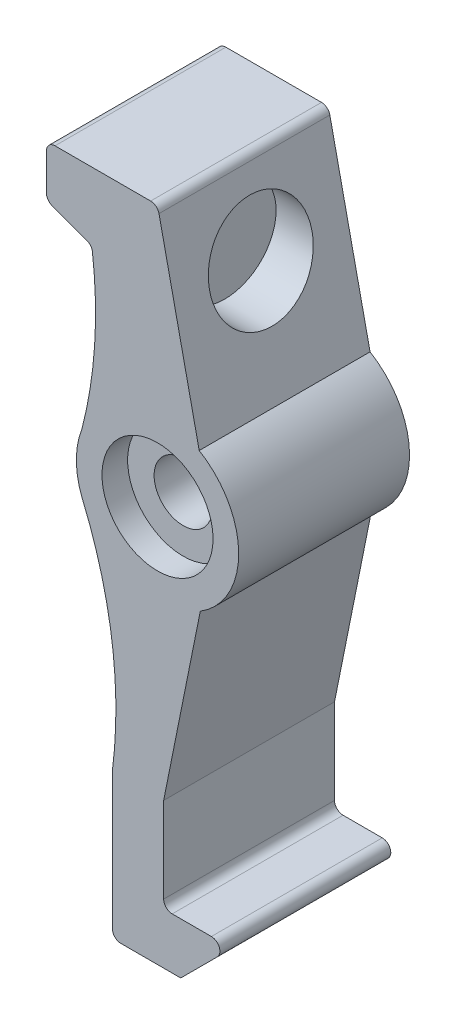
ISO-10303-21;
HEADER;
FILE_DESCRIPTION(('STEP AP214'),'2;1');
FILE_NAME('part.step','',(''),(''),'','','');
FILE_SCHEMA(('AUTOMOTIVE_DESIGN { 1 0 10303 214 1 1 1 1 }'));
ENDSEC;
DATA;
#1=APPLICATION_CONTEXT('core data for automotive mechanical design processes');
#2=APPLICATION_PROTOCOL_DEFINITION('international standard','automotive_design',2000,#1);
#3=PRODUCT_CONTEXT('',#1,'mechanical');
#4=PRODUCT('Part','Part','',(#3));
#5=PRODUCT_RELATED_PRODUCT_CATEGORY('part','',(#4));
#6=PRODUCT_DEFINITION_FORMATION('','',#4);
#7=PRODUCT_DEFINITION_CONTEXT('part definition',#1,'design');
#8=PRODUCT_DEFINITION('design','',#6,#7);
#9=PRODUCT_DEFINITION_SHAPE('','',#8);
#10=(LENGTH_UNIT() NAMED_UNIT(*) SI_UNIT(.MILLI.,.METRE.));
#11=(NAMED_UNIT(*) PLANE_ANGLE_UNIT() SI_UNIT($,.RADIAN.));
#12=(NAMED_UNIT(*) SI_UNIT($,.STERADIAN.) SOLID_ANGLE_UNIT());
#13=UNCERTAINTY_MEASURE_WITH_UNIT(LENGTH_MEASURE(1.E-05),#10,'distance_accuracy_value','');
#14=(GEOMETRIC_REPRESENTATION_CONTEXT(3) GLOBAL_UNCERTAINTY_ASSIGNED_CONTEXT((#13)) GLOBAL_UNIT_ASSIGNED_CONTEXT((#10,
#11,#12)) REPRESENTATION_CONTEXT('',''));
#15=CARTESIAN_POINT('',(0.,0.,0.));
#16=DIRECTION('',(0.,0.,1.));
#17=DIRECTION('',(1.,0.,0.));
#18=AXIS2_PLACEMENT_3D('',#15,#16,#17);
#19=CARTESIAN_POINT('',(0.,0.,-5.));
#20=DIRECTION('',(0.,0.,1.));
#21=DIRECTION('',(1.,0.,0.));
#22=AXIS2_PLACEMENT_3D('',#19,#20,#21);
#23=PLANE('',#22);
#24=DIRECTION('',(1.,0.,0.));
#25=VECTOR('',#24,1.);
#26=CARTESIAN_POINT('',(0.,15.3,-5.));
#27=LINE('',#26,#25);
#28=CARTESIAN_POINT('',(-6.,15.3,-5.));
#29=VERTEX_POINT('',#28);
#30=CARTESIAN_POINT('',(-0.402987495876589,15.3,-5.));
#31=VERTEX_POINT('',#30);
#32=EDGE_CURVE('E227',#29,#31,#27,.T.);
#33=ORIENTED_EDGE('',*,*,#32,.T.);
#34=CARTESIAN_POINT('',(-0.402987495876589,14.8,-5.));
#35=DIRECTION('',(0.,0.,1.));
#36=DIRECTION('',(1.,0.,0.));
#37=AXIS2_PLACEMENT_3D('',#34,#35,#36);
#38=CIRCLE('',#37,0.499999999999999);
#39=CARTESIAN_POINT('',(0.0856019190587525,14.9062091503268,-5.));
#40=VERTEX_POINT('',#39);
#41=EDGE_CURVE('E277',#31,#40,#38,.F.);
#42=ORIENTED_EDGE('',*,*,#41,.T.);
#43=DIRECTION('',(0.212418300653595,-0.977178829870684,0.));
#44=VECTOR('',#43,1.);
#45=CARTESIAN_POINT('',(3.17583119707972,0.690359477124184,-5.));
#46=LINE('',#45,#44);
#47=CARTESIAN_POINT('',(2.43999261870079,4.07540623995764,-5.));
#48=VERTEX_POINT('',#47);
#49=EDGE_CURVE('E275',#40,#48,#46,.T.);
#50=ORIENTED_EDGE('',*,*,#49,.T.);
#51=CARTESIAN_POINT('',(0.,0.,-5.));
#52=DIRECTION('',(0.,0.,1.));
#53=DIRECTION('',(1.,0.,0.));
#54=AXIS2_PLACEMENT_3D('',#51,#52,#53);
#55=CIRCLE('',#54,4.75);
#56=CARTESIAN_POINT('',(2.50332638844661,-4.03681272700467,-5.));
#57=VERTEX_POINT('',#56);
#58=EDGE_CURVE('E215',#57,#48,#55,.T.);
#59=ORIENTED_EDGE('',*,*,#58,.F.);
#60=DIRECTION('',(0.197135263261177,0.980376299172387,0.));
#61=VECTOR('',#60,1.);
#62=CARTESIAN_POINT('',(3.18622297231026,-0.640689605598826,-5.));
#63=LINE('',#62,#61);
#64=CARTESIAN_POINT('',(0.359159672013634,-14.7,-5.));
#65=VERTEX_POINT('',#64);
#66=EDGE_CURVE('E273',#65,#57,#63,.T.);
#67=ORIENTED_EDGE('',*,*,#66,.F.);
#68=DIRECTION('',(0.,-1.,0.));
#69=VECTOR('',#68,1.);
#70=CARTESIAN_POINT('',(0.359159672013633,0.,-5.));
#71=LINE('',#70,#69);
#72=CARTESIAN_POINT('',(0.359159672013635,-19.7,-5.));
#73=VERTEX_POINT('',#72);
#74=EDGE_CURVE('E270',#65,#73,#71,.T.);
#75=ORIENTED_EDGE('',*,*,#74,.T.);
#76=CARTESIAN_POINT('',(0.859159672013635,-19.7,-5.));
#77=DIRECTION('',(0.,0.,1.));
#78=DIRECTION('',(1.,0.,0.));
#79=AXIS2_PLACEMENT_3D('',#76,#77,#78);
#80=CIRCLE('',#79,0.5);
#81=CARTESIAN_POINT('',(0.859159672013635,-20.2,-5.));
#82=VERTEX_POINT('',#81);
#83=EDGE_CURVE('E267',#73,#82,#80,.T.);
#84=ORIENTED_EDGE('',*,*,#83,.T.);
#85=DIRECTION('',(1.,0.,0.));
#86=VECTOR('',#85,1.);
#87=CARTESIAN_POINT('',(0.,-20.2,-5.));
#88=LINE('',#87,#86);
#89=CARTESIAN_POINT('',(3.15205289082709,-20.2,-5.));
#90=VERTEX_POINT('',#89);
#91=EDGE_CURVE('E264',#82,#90,#88,.T.);
#92=ORIENTED_EDGE('',*,*,#91,.T.);
#93=CARTESIAN_POINT('',(3.15205289082709,-20.7,-5.));
#94=DIRECTION('',(0.,0.,1.));
#95=DIRECTION('',(1.,0.,0.));
#96=AXIS2_PLACEMENT_3D('',#93,#94,#95);
#97=CIRCLE('',#96,0.499999999999998);
#98=CARTESIAN_POINT('',(3.50560628142037,-21.0535533905933,-5.));
#99=VERTEX_POINT('',#98);
#100=EDGE_CURVE('E261',#90,#99,#97,.F.);
#101=ORIENTED_EDGE('',*,*,#100,.T.);
#102=DIRECTION('',(-0.707106781186546,-0.707106781186549,0.));
#103=VECTOR('',#102,1.);
#104=CARTESIAN_POINT('',(12.2795798360068,-12.2795798360068,-5.));
#105=LINE('',#104,#103);
#106=CARTESIAN_POINT('',(1.35915967201365,-23.2,-5.));
#107=VERTEX_POINT('',#106);
#108=EDGE_CURVE('E258',#99,#107,#105,.T.);
#109=ORIENTED_EDGE('',*,*,#108,.T.);
#110=DIRECTION('',(-1.,0.,0.));
#111=VECTOR('',#110,1.);
#112=CARTESIAN_POINT('',(0.,-23.2,-5.));
#113=LINE('',#112,#111);
#114=CARTESIAN_POINT('',(-2.14084032798637,-23.2,-5.));
#115=VERTEX_POINT('',#114);
#116=EDGE_CURVE('E255',#107,#115,#113,.T.);
#117=ORIENTED_EDGE('',*,*,#116,.T.);
#118=CARTESIAN_POINT('',(-2.14084032798637,-22.7,-5.));
#119=DIRECTION('',(0.,0.,1.));
#120=DIRECTION('',(1.,0.,0.));
#121=AXIS2_PLACEMENT_3D('',#118,#119,#120);
#122=CIRCLE('',#121,0.500000000000001);
#123=CARTESIAN_POINT('',(-2.64084032798637,-22.7,-5.));
#124=VERTEX_POINT('',#123);
#125=EDGE_CURVE('E252',#115,#124,#122,.F.);
#126=ORIENTED_EDGE('',*,*,#125,.T.);
#127=DIRECTION('',(0.,1.,0.));
#128=VECTOR('',#127,1.);
#129=CARTESIAN_POINT('',(-2.64084032798637,0.,-5.));
#130=LINE('',#129,#128);
#131=CARTESIAN_POINT('',(-2.64084032798637,-14.7,-5.));
#132=VERTEX_POINT('',#131);
#133=EDGE_CURVE('E249',#124,#132,#130,.T.);
#134=ORIENTED_EDGE('',*,*,#133,.T.);
#135=CARTESIAN_POINT('',(-27.4351945240529,-11.5,-5.));
#136=DIRECTION('',(0.,0.,1.));
#137=DIRECTION('',(1.,0.,0.));
#138=AXIS2_PLACEMENT_3D('',#135,#136,#137);
#139=CIRCLE('',#138,25.);
#140=CARTESIAN_POINT('',(-4.42869402465919,-1.7173145419369,-5.));
#141=VERTEX_POINT('',#140);
#142=EDGE_CURVE('E246',#141,#132,#139,.F.);
#143=ORIENTED_EDGE('',*,*,#142,.F.);
#144=CARTESIAN_POINT('',(-4.42869402465914,1.71731454193704,-5.));
#145=VERTEX_POINT('',#144);
#146=EDGE_CURVE('E244',#145,#141,#55,.T.);
#147=ORIENTED_EDGE('',*,*,#146,.F.);
#148=CARTESIAN_POINT('',(-28.6263770425649,8.,-5.));
#149=DIRECTION('',(0.,0.,1.));
#150=DIRECTION('',(1.,0.,0.));
#151=AXIS2_PLACEMENT_3D('',#148,#149,#150);
#152=CIRCLE('',#151,25.);
#153=CARTESIAN_POINT('',(-3.8107161008924,11.030341899514,-5.));
#154=VERTEX_POINT('',#153);
#155=EDGE_CURVE('E241',#145,#154,#152,.T.);
#156=ORIENTED_EDGE('',*,*,#155,.T.);
#157=CARTESIAN_POINT('',(-4.30702931972585,10.9697350615237,-5.));
#158=DIRECTION('',(0.,0.,1.));
#159=DIRECTION('',(1.,0.,0.));
#160=AXIS2_PLACEMENT_3D('',#157,#158,#159);
#161=CIRCLE('',#160,0.499999999999998);
#162=CARTESIAN_POINT('',(-4.13601924806301,11.4395813719167,-5.));
#163=VERTEX_POINT('',#162);
#164=EDGE_CURVE('E238',#163,#154,#161,.F.);
#165=ORIENTED_EDGE('',*,*,#164,.F.);
#166=DIRECTION('',(0.939692620785908,-0.342020143325669,0.));
#167=VECTOR('',#166,1.);
#168=CARTESIAN_POINT('',(3.1927882397089,8.77211359370046,-5.));
#169=LINE('',#168,#167);
#170=CARTESIAN_POINT('',(-6.17101007166283,12.1802574587119,-5.));
#171=VERTEX_POINT('',#170);
#172=EDGE_CURVE('E236',#171,#163,#169,.T.);
#173=ORIENTED_EDGE('',*,*,#172,.F.);
#174=CARTESIAN_POINT('',(-6.,12.6501037691049,-5.));
#175=DIRECTION('',(0.,0.,1.));
#176=DIRECTION('',(1.,0.,0.));
#177=AXIS2_PLACEMENT_3D('',#174,#175,#176);
#178=CIRCLE('',#177,0.500000000000001);
#179=CARTESIAN_POINT('',(-6.5,12.6501037691049,-5.));
#180=VERTEX_POINT('',#179);
#181=EDGE_CURVE('E234',#180,#171,#178,.T.);
#182=ORIENTED_EDGE('',*,*,#181,.F.);
#183=DIRECTION('',(0.,-1.,0.));
#184=VECTOR('',#183,1.);
#185=CARTESIAN_POINT('',(-6.5,0.,-5.));
#186=LINE('',#185,#184);
#187=CARTESIAN_POINT('',(-6.5,14.8,-5.));
#188=VERTEX_POINT('',#187);
#189=EDGE_CURVE('E232',#188,#180,#186,.T.);
#190=ORIENTED_EDGE('',*,*,#189,.F.);
#191=CARTESIAN_POINT('',(-6.,14.8,-5.));
#192=DIRECTION('',(0.,0.,1.));
#193=DIRECTION('',(1.,0.,0.));
#194=AXIS2_PLACEMENT_3D('',#191,#192,#193);
#195=CIRCLE('',#194,0.5);
#196=EDGE_CURVE('E229',#29,#188,#195,.T.);
#197=ORIENTED_EDGE('',*,*,#196,.F.);
#198=EDGE_LOOP('',(#33,#42,#50,#59,#67,#75,#84,#92,#101,#109,#117,#126,#134,#143,#147,#156,#165,
#173,#182,#190,#197));
#199=FACE_BOUND('',#198,.T.);
#200=CARTESIAN_POINT('',(0.,0.,-5.));
#201=DIRECTION('',(0.,0.,1.));
#202=DIRECTION('',(1.,0.,0.));
#203=AXIS2_PLACEMENT_3D('',#200,#201,#202);
#204=CIRCLE('',#203,3.25);
#205=CARTESIAN_POINT('',(3.25,0.,-5.));
#206=VERTEX_POINT('',#205);
#207=EDGE_CURVE('E423',#206,#206,#204,.T.);
#208=ORIENTED_EDGE('',*,*,#207,.T.);
#209=EDGE_LOOP('',(#208));
#210=FACE_BOUND('',#209,.T.);
#211=ADVANCED_FACE('F50',(#199,#210),#23,.F.);
#212=CARTESIAN_POINT('',(0.,0.,5.));
#213=DIRECTION('',(0.,0.,-1.));
#214=DIRECTION('',(-1.,0.,0.));
#215=AXIS2_PLACEMENT_3D('',#212,#213,#214);
#216=CYLINDRICAL_SURFACE('',#215,1.7);
#217=CARTESIAN_POINT('',(0.,0.,-3.5));
#218=DIRECTION('',(0.,0.,1.));
#219=DIRECTION('',(1.,0.,0.));
#220=AXIS2_PLACEMENT_3D('',#217,#218,#219);
#221=CIRCLE('',#220,1.7);
#222=CARTESIAN_POINT('',(1.7,0.,-3.5));
#223=VERTEX_POINT('',#222);
#224=EDGE_CURVE('E420',#223,#223,#221,.T.);
#225=ORIENTED_EDGE('',*,*,#224,.F.);
#226=EDGE_LOOP('',(#225));
#227=FACE_BOUND('',#226,.T.);
#228=CARTESIAN_POINT('',(0.,0.,3.5));
#229=DIRECTION('',(0.,0.,1.));
#230=DIRECTION('',(1.,0.,0.));
#231=AXIS2_PLACEMENT_3D('',#228,#229,#230);
#232=CIRCLE('',#231,1.7);
#233=CARTESIAN_POINT('',(1.7,0.,3.5));
#234=VERTEX_POINT('',#233);
#235=EDGE_CURVE('E433',#234,#234,#232,.T.);
#236=ORIENTED_EDGE('',*,*,#235,.T.);
#237=EDGE_LOOP('',(#236));
#238=FACE_BOUND('',#237,.T.);
#239=ADVANCED_FACE('F400',(#227,#238),#216,.F.);
#240=CARTESIAN_POINT('',(0.,15.3,5.));
#241=DIRECTION('',(0.,1.,0.));
#242=DIRECTION('',(-1.,0.,0.));
#243=AXIS2_PLACEMENT_3D('',#240,#241,#242);
#244=PLANE('',#243);
#245=ORIENTED_EDGE('',*,*,#32,.F.);
#246=DIRECTION('',(0.,0.,-1.));
#247=VECTOR('',#246,1.);
#248=CARTESIAN_POINT('',(-6.,15.3,5.));
#249=LINE('',#248,#247);
#250=CARTESIAN_POINT('',(-6.,15.3,5.));
#251=VERTEX_POINT('',#250);
#252=EDGE_CURVE('E12',#251,#29,#249,.T.);
#253=ORIENTED_EDGE('',*,*,#252,.F.);
#254=DIRECTION('',(1.,0.,0.));
#255=VECTOR('',#254,1.);
#256=CARTESIAN_POINT('',(0.,15.3,5.));
#257=LINE('',#256,#255);
#258=CARTESIAN_POINT('',(-0.402987495876589,15.3,5.));
#259=VERTEX_POINT('',#258);
#260=EDGE_CURVE('E280',#251,#259,#257,.T.);
#261=ORIENTED_EDGE('',*,*,#260,.T.);
#262=DIRECTION('',(0.,0.,-1.));
#263=VECTOR('',#262,1.);
#264=CARTESIAN_POINT('',(-0.402987495876589,15.3,5.));
#265=LINE('',#264,#263);
#266=EDGE_CURVE('E68',#259,#31,#265,.T.);
#267=ORIENTED_EDGE('',*,*,#266,.T.);
#268=EDGE_LOOP('',(#245,#253,#261,#267));
#269=FACE_BOUND('',#268,.T.);
#270=ADVANCED_FACE('F52',(#269),#244,.T.);
#271=CARTESIAN_POINT('',(-6.,14.8,5.));
#272=DIRECTION('',(0.,0.,-1.));
#273=DIRECTION('',(-1.,0.,0.));
#274=AXIS2_PLACEMENT_3D('',#271,#272,#273);
#275=CYLINDRICAL_SURFACE('',#274,0.5);
#276=ORIENTED_EDGE('',*,*,#196,.T.);
#277=DIRECTION('',(0.,0.,-1.));
#278=VECTOR('',#277,1.);
#279=CARTESIAN_POINT('',(-6.5,14.8,5.));
#280=LINE('',#279,#278);
#281=CARTESIAN_POINT('',(-6.5,14.8,5.));
#282=VERTEX_POINT('',#281);
#283=EDGE_CURVE('E60',#282,#188,#280,.T.);
#284=ORIENTED_EDGE('',*,*,#283,.F.);
#285=CARTESIAN_POINT('',(-6.,14.8,5.));
#286=DIRECTION('',(0.,0.,1.));
#287=DIRECTION('',(1.,0.,0.));
#288=AXIS2_PLACEMENT_3D('',#285,#286,#287);
#289=CIRCLE('',#288,0.5);
#290=EDGE_CURVE('E444',#251,#282,#289,.T.);
#291=ORIENTED_EDGE('',*,*,#290,.F.);
#292=ORIENTED_EDGE('',*,*,#252,.T.);
#293=EDGE_LOOP('',(#276,#284,#291,#292));
#294=FACE_BOUND('',#293,.T.);
#295=ADVANCED_FACE('F445',(#294),#275,.T.);
#296=CARTESIAN_POINT('',(-6.5,0.,5.));
#297=DIRECTION('',(1.,0.,0.));
#298=DIRECTION('',(0.,0.,-1.));
#299=AXIS2_PLACEMENT_3D('',#296,#297,#298);
#300=PLANE('',#299);
#301=ORIENTED_EDGE('',*,*,#189,.T.);
#302=DIRECTION('',(0.,0.,-1.));
#303=VECTOR('',#302,1.);
#304=CARTESIAN_POINT('',(-6.5,12.6501037691049,5.));
#305=LINE('',#304,#303);
#306=CARTESIAN_POINT('',(-6.5,12.6501037691049,5.));
#307=VERTEX_POINT('',#306);
#308=EDGE_CURVE('E315',#307,#180,#305,.T.);
#309=ORIENTED_EDGE('',*,*,#308,.F.);
#310=DIRECTION('',(0.,-1.,0.));
#311=VECTOR('',#310,1.);
#312=CARTESIAN_POINT('',(-6.5,0.,5.));
#313=LINE('',#312,#311);
#314=EDGE_CURVE('E325',#282,#307,#313,.T.);
#315=ORIENTED_EDGE('',*,*,#314,.F.);
#316=ORIENTED_EDGE('',*,*,#283,.T.);
#317=EDGE_LOOP('',(#301,#309,#315,#316));
#318=FACE_BOUND('',#317,.T.);
#319=ADVANCED_FACE('F323',(#318),#300,.F.);
#320=CARTESIAN_POINT('',(-6.,12.6501037691049,5.));
#321=DIRECTION('',(0.,0.,-1.));
#322=DIRECTION('',(-1.,0.,0.));
#323=AXIS2_PLACEMENT_3D('',#320,#321,#322);
#324=CYLINDRICAL_SURFACE('',#323,0.500000000000001);
#325=ORIENTED_EDGE('',*,*,#181,.T.);
#326=DIRECTION('',(0.,0.,-1.));
#327=VECTOR('',#326,1.);
#328=CARTESIAN_POINT('',(-6.17101007166283,12.1802574587119,5.));
#329=LINE('',#328,#327);
#330=CARTESIAN_POINT('',(-6.17101007166283,12.1802574587119,5.));
#331=VERTEX_POINT('',#330);
#332=EDGE_CURVE('E312',#331,#171,#329,.T.);
#333=ORIENTED_EDGE('',*,*,#332,.F.);
#334=CARTESIAN_POINT('',(-6.,12.6501037691049,5.));
#335=DIRECTION('',(0.,0.,1.));
#336=DIRECTION('',(1.,0.,0.));
#337=AXIS2_PLACEMENT_3D('',#334,#335,#336);
#338=CIRCLE('',#337,0.500000000000001);
#339=EDGE_CURVE('E344',#307,#331,#338,.T.);
#340=ORIENTED_EDGE('',*,*,#339,.F.);
#341=ORIENTED_EDGE('',*,*,#308,.T.);
#342=EDGE_LOOP('',(#325,#333,#340,#341));
#343=FACE_BOUND('',#342,.T.);
#344=ADVANCED_FACE('F335',(#343),#324,.T.);
#345=CARTESIAN_POINT('',(3.1927882397089,8.77211359370046,5.));
#346=DIRECTION('',(0.342020143325669,0.939692620785908,0.));
#347=DIRECTION('',(-0.939692620785908,0.342020143325669,0.));
#348=AXIS2_PLACEMENT_3D('',#345,#346,#347);
#349=PLANE('',#348);
#350=ORIENTED_EDGE('',*,*,#172,.T.);
#351=DIRECTION('',(0.,0.,-1.));
#352=VECTOR('',#351,1.);
#353=CARTESIAN_POINT('',(-4.13601924806301,11.4395813719167,5.));
#354=LINE('',#353,#352);
#355=CARTESIAN_POINT('',(-4.13601924806301,11.4395813719167,5.));
#356=VERTEX_POINT('',#355);
#357=EDGE_CURVE('E309',#356,#163,#354,.T.);
#358=ORIENTED_EDGE('',*,*,#357,.F.);
#359=DIRECTION('',(0.939692620785908,-0.342020143325669,0.));
#360=VECTOR('',#359,1.);
#361=CARTESIAN_POINT('',(3.1927882397089,8.77211359370046,5.));
#362=LINE('',#361,#360);
#363=EDGE_CURVE('E341',#331,#356,#362,.T.);
#364=ORIENTED_EDGE('',*,*,#363,.F.);
#365=ORIENTED_EDGE('',*,*,#332,.T.);
#366=EDGE_LOOP('',(#350,#358,#364,#365));
#367=FACE_BOUND('',#366,.T.);
#368=ADVANCED_FACE('F339',(#367),#349,.F.);
#369=CARTESIAN_POINT('',(-4.30702931972585,10.9697350615237,5.));
#370=DIRECTION('',(0.,0.,-1.));
#371=DIRECTION('',(-1.,0.,0.));
#372=AXIS2_PLACEMENT_3D('',#369,#370,#371);
#373=CYLINDRICAL_SURFACE('',#372,0.499999999999998);
#374=ORIENTED_EDGE('',*,*,#164,.T.);
#375=DIRECTION('',(0.,0.,-1.));
#376=VECTOR('',#375,1.);
#377=CARTESIAN_POINT('',(-3.8107161008924,11.030341899514,5.));
#378=LINE('',#377,#376);
#379=CARTESIAN_POINT('',(-3.8107161008924,11.030341899514,5.));
#380=VERTEX_POINT('',#379);
#381=EDGE_CURVE('E307',#380,#154,#378,.T.);
#382=ORIENTED_EDGE('',*,*,#381,.F.);
#383=CARTESIAN_POINT('',(-4.30702931972585,10.9697350615237,5.));
#384=DIRECTION('',(0.,0.,1.));
#385=DIRECTION('',(1.,0.,0.));
#386=AXIS2_PLACEMENT_3D('',#383,#384,#385);
#387=CIRCLE('',#386,0.499999999999998);
#388=EDGE_CURVE('E343',#356,#380,#387,.F.);
#389=ORIENTED_EDGE('',*,*,#388,.F.);
#390=ORIENTED_EDGE('',*,*,#357,.T.);
#391=EDGE_LOOP('',(#374,#382,#389,#390));
#392=FACE_BOUND('',#391,.T.);
#393=ADVANCED_FACE('F457',(#392),#373,.F.);
#394=CARTESIAN_POINT('',(-28.6263770425649,8.,5.));
#395=DIRECTION('',(0.,0.,-1.));
#396=DIRECTION('',(-1.,0.,0.));
#397=AXIS2_PLACEMENT_3D('',#394,#395,#396);
#398=CYLINDRICAL_SURFACE('',#397,25.);
#399=ORIENTED_EDGE('',*,*,#155,.F.);
#400=DIRECTION('',(0.,0.,-1.));
#401=VECTOR('',#400,1.);
#402=CARTESIAN_POINT('',(-4.42869402465914,1.71731454193704,5.));
#403=LINE('',#402,#401);
#404=CARTESIAN_POINT('',(-4.42869402465914,1.71731454193704,5.));
#405=VERTEX_POINT('',#404);
#406=EDGE_CURVE('E305',#405,#145,#403,.T.);
#407=ORIENTED_EDGE('',*,*,#406,.F.);
#408=CARTESIAN_POINT('',(-28.6263770425649,8.,5.));
#409=DIRECTION('',(0.,0.,1.));
#410=DIRECTION('',(1.,0.,0.));
#411=AXIS2_PLACEMENT_3D('',#408,#409,#410);
#412=CIRCLE('',#411,25.);
#413=EDGE_CURVE('E346',#405,#380,#412,.T.);
#414=ORIENTED_EDGE('',*,*,#413,.T.);
#415=ORIENTED_EDGE('',*,*,#381,.T.);
#416=EDGE_LOOP('',(#399,#407,#414,#415));
#417=FACE_BOUND('',#416,.T.);
#418=ADVANCED_FACE('F460',(#417),#398,.F.);
#419=CARTESIAN_POINT('',(0.,0.,5.));
#420=DIRECTION('',(0.,0.,-1.));
#421=DIRECTION('',(-1.,0.,0.));
#422=AXIS2_PLACEMENT_3D('',#419,#420,#421);
#423=CYLINDRICAL_SURFACE('',#422,4.75);
#424=ORIENTED_EDGE('',*,*,#146,.T.);
#425=DIRECTION('',(0.,0.,-1.));
#426=VECTOR('',#425,1.);
#427=CARTESIAN_POINT('',(-4.42869402465919,-1.7173145419369,5.));
#428=LINE('',#427,#426);
#429=CARTESIAN_POINT('',(-4.42869402465919,-1.7173145419369,5.));
#430=VERTEX_POINT('',#429);
#431=EDGE_CURVE('E302',#430,#141,#428,.T.);
#432=ORIENTED_EDGE('',*,*,#431,.F.);
#433=CARTESIAN_POINT('',(0.,0.,5.));
#434=DIRECTION('',(0.,0.,1.));
#435=DIRECTION('',(1.,0.,0.));
#436=AXIS2_PLACEMENT_3D('',#433,#434,#435);
#437=CIRCLE('',#436,4.75);
#438=EDGE_CURVE('E210',#405,#430,#437,.T.);
#439=ORIENTED_EDGE('',*,*,#438,.F.);
#440=ORIENTED_EDGE('',*,*,#406,.T.);
#441=EDGE_LOOP('',(#424,#432,#439,#440));
#442=FACE_BOUND('',#441,.T.);
#443=ADVANCED_FACE('F397',(#442),#423,.T.);
#444=CARTESIAN_POINT('',(-27.4351945240529,-11.5,5.));
#445=DIRECTION('',(0.,0.,-1.));
#446=DIRECTION('',(-1.,0.,0.));
#447=AXIS2_PLACEMENT_3D('',#444,#445,#446);
#448=CYLINDRICAL_SURFACE('',#447,25.);
#449=ORIENTED_EDGE('',*,*,#142,.T.);
#450=DIRECTION('',(0.,0.,-1.));
#451=VECTOR('',#450,1.);
#452=CARTESIAN_POINT('',(-2.64084032798637,-14.7,5.));
#453=LINE('',#452,#451);
#454=CARTESIAN_POINT('',(-2.64084032798637,-14.7,5.));
#455=VERTEX_POINT('',#454);
#456=EDGE_CURVE('E300',#455,#132,#453,.T.);
#457=ORIENTED_EDGE('',*,*,#456,.F.);
#458=CARTESIAN_POINT('',(-27.4351945240529,-11.5,5.));
#459=DIRECTION('',(0.,0.,1.));
#460=DIRECTION('',(1.,0.,0.));
#461=AXIS2_PLACEMENT_3D('',#458,#459,#460);
#462=CIRCLE('',#461,25.);
#463=EDGE_CURVE('E353',#430,#455,#462,.F.);
#464=ORIENTED_EDGE('',*,*,#463,.F.);
#465=ORIENTED_EDGE('',*,*,#431,.T.);
#466=EDGE_LOOP('',(#449,#457,#464,#465));
#467=FACE_BOUND('',#466,.T.);
#468=ADVANCED_FACE('F465',(#467),#448,.F.);
#469=CARTESIAN_POINT('',(-2.64084032798637,0.,5.));
#470=DIRECTION('',(-1.,0.,0.));
#471=DIRECTION('',(0.,-1.,0.));
#472=AXIS2_PLACEMENT_3D('',#469,#470,#471);
#473=PLANE('',#472);
#474=ORIENTED_EDGE('',*,*,#133,.F.);
#475=DIRECTION('',(0.,0.,-1.));
#476=VECTOR('',#475,1.);
#477=CARTESIAN_POINT('',(-2.64084032798637,-22.7,5.));
#478=LINE('',#477,#476);
#479=CARTESIAN_POINT('',(-2.64084032798637,-22.7,5.));
#480=VERTEX_POINT('',#479);
#481=EDGE_CURVE('E298',#480,#124,#478,.T.);
#482=ORIENTED_EDGE('',*,*,#481,.F.);
#483=DIRECTION('',(0.,1.,0.));
#484=VECTOR('',#483,1.);
#485=CARTESIAN_POINT('',(-2.64084032798637,0.,5.));
#486=LINE('',#485,#484);
#487=EDGE_CURVE('E355',#480,#455,#486,.T.);
#488=ORIENTED_EDGE('',*,*,#487,.T.);
#489=ORIENTED_EDGE('',*,*,#456,.T.);
#490=EDGE_LOOP('',(#474,#482,#488,#489));
#491=FACE_BOUND('',#490,.T.);
#492=ADVANCED_FACE('F468',(#491),#473,.T.);
#493=CARTESIAN_POINT('',(-2.14084032798637,-22.7,5.));
#494=DIRECTION('',(0.,0.,-1.));
#495=DIRECTION('',(-1.,0.,0.));
#496=AXIS2_PLACEMENT_3D('',#493,#494,#495);
#497=CYLINDRICAL_SURFACE('',#496,0.500000000000001);
#498=ORIENTED_EDGE('',*,*,#125,.F.);
#499=DIRECTION('',(0.,0.,-1.));
#500=VECTOR('',#499,1.);
#501=CARTESIAN_POINT('',(-2.14084032798637,-23.2,5.));
#502=LINE('',#501,#500);
#503=CARTESIAN_POINT('',(-2.14084032798637,-23.2,5.));
#504=VERTEX_POINT('',#503);
#505=EDGE_CURVE('E296',#504,#115,#502,.T.);
#506=ORIENTED_EDGE('',*,*,#505,.F.);
#507=CARTESIAN_POINT('',(-2.14084032798637,-22.7,5.));
#508=DIRECTION('',(0.,0.,1.));
#509=DIRECTION('',(1.,0.,0.));
#510=AXIS2_PLACEMENT_3D('',#507,#508,#509);
#511=CIRCLE('',#510,0.500000000000001);
#512=EDGE_CURVE('E358',#504,#480,#511,.F.);
#513=ORIENTED_EDGE('',*,*,#512,.T.);
#514=ORIENTED_EDGE('',*,*,#481,.T.);
#515=EDGE_LOOP('',(#498,#506,#513,#514));
#516=FACE_BOUND('',#515,.T.);
#517=ADVANCED_FACE('F472',(#516),#497,.T.);
#518=CARTESIAN_POINT('',(0.,-23.2,5.));
#519=DIRECTION('',(0.,-1.,0.));
#520=DIRECTION('',(0.,0.,-1.));
#521=AXIS2_PLACEMENT_3D('',#518,#519,#520);
#522=PLANE('',#521);
#523=ORIENTED_EDGE('',*,*,#116,.F.);
#524=DIRECTION('',(0.,0.,-1.));
#525=VECTOR('',#524,1.);
#526=CARTESIAN_POINT('',(1.35915967201365,-23.2,5.));
#527=LINE('',#526,#525);
#528=CARTESIAN_POINT('',(1.35915967201365,-23.2,5.));
#529=VERTEX_POINT('',#528);
#530=EDGE_CURVE('E294',#529,#107,#527,.T.);
#531=ORIENTED_EDGE('',*,*,#530,.F.);
#532=DIRECTION('',(-1.,0.,0.));
#533=VECTOR('',#532,1.);
#534=CARTESIAN_POINT('',(0.,-23.2,5.));
#535=LINE('',#534,#533);
#536=EDGE_CURVE('E361',#529,#504,#535,.T.);
#537=ORIENTED_EDGE('',*,*,#536,.T.);
#538=ORIENTED_EDGE('',*,*,#505,.T.);
#539=EDGE_LOOP('',(#523,#531,#537,#538));
#540=FACE_BOUND('',#539,.T.);
#541=ADVANCED_FACE('F476',(#540),#522,.T.);
#542=CARTESIAN_POINT('',(12.2795798360068,-12.2795798360068,5.));
#543=DIRECTION('',(0.707106781186549,-0.707106781186546,0.));
#544=DIRECTION('',(0.707106781186546,0.707106781186549,0.));
#545=AXIS2_PLACEMENT_3D('',#542,#543,#544);
#546=PLANE('',#545);
#547=ORIENTED_EDGE('',*,*,#108,.F.);
#548=DIRECTION('',(0.,0.,-1.));
#549=VECTOR('',#548,1.);
#550=CARTESIAN_POINT('',(3.50560628142037,-21.0535533905933,5.));
#551=LINE('',#550,#549);
#552=CARTESIAN_POINT('',(3.50560628142037,-21.0535533905933,5.));
#553=VERTEX_POINT('',#552);
#554=EDGE_CURVE('E292',#553,#99,#551,.T.);
#555=ORIENTED_EDGE('',*,*,#554,.F.);
#556=DIRECTION('',(-0.707106781186546,-0.707106781186549,0.));
#557=VECTOR('',#556,1.);
#558=CARTESIAN_POINT('',(12.2795798360068,-12.2795798360068,5.));
#559=LINE('',#558,#557);
#560=EDGE_CURVE('E364',#553,#529,#559,.T.);
#561=ORIENTED_EDGE('',*,*,#560,.T.);
#562=ORIENTED_EDGE('',*,*,#530,.T.);
#563=EDGE_LOOP('',(#547,#555,#561,#562));
#564=FACE_BOUND('',#563,.T.);
#565=ADVANCED_FACE('F480',(#564),#546,.T.);
#566=CARTESIAN_POINT('',(3.15205289082709,-20.7,5.));
#567=DIRECTION('',(0.,0.,-1.));
#568=DIRECTION('',(-1.,0.,0.));
#569=AXIS2_PLACEMENT_3D('',#566,#567,#568);
#570=CYLINDRICAL_SURFACE('',#569,0.499999999999998);
#571=ORIENTED_EDGE('',*,*,#100,.F.);
#572=DIRECTION('',(0.,0.,-1.));
#573=VECTOR('',#572,1.);
#574=CARTESIAN_POINT('',(3.15205289082709,-20.2,5.));
#575=LINE('',#574,#573);
#576=CARTESIAN_POINT('',(3.15205289082709,-20.2,5.));
#577=VERTEX_POINT('',#576);
#578=EDGE_CURVE('E290',#577,#90,#575,.T.);
#579=ORIENTED_EDGE('',*,*,#578,.F.);
#580=CARTESIAN_POINT('',(3.15205289082709,-20.7,5.));
#581=DIRECTION('',(0.,0.,1.));
#582=DIRECTION('',(1.,0.,0.));
#583=AXIS2_PLACEMENT_3D('',#580,#581,#582);
#584=CIRCLE('',#583,0.499999999999998);
#585=EDGE_CURVE('E367',#577,#553,#584,.F.);
#586=ORIENTED_EDGE('',*,*,#585,.T.);
#587=ORIENTED_EDGE('',*,*,#554,.T.);
#588=EDGE_LOOP('',(#571,#579,#586,#587));
#589=FACE_BOUND('',#588,.T.);
#590=ADVANCED_FACE('F484',(#589),#570,.T.);
#591=CARTESIAN_POINT('',(0.,-20.2,5.));
#592=DIRECTION('',(0.,1.,0.));
#593=DIRECTION('',(-1.,0.,0.));
#594=AXIS2_PLACEMENT_3D('',#591,#592,#593);
#595=PLANE('',#594);
#596=ORIENTED_EDGE('',*,*,#91,.F.);
#597=DIRECTION('',(0.,0.,-1.));
#598=VECTOR('',#597,1.);
#599=CARTESIAN_POINT('',(0.859159672013635,-20.2,5.));
#600=LINE('',#599,#598);
#601=CARTESIAN_POINT('',(0.859159672013635,-20.2,5.));
#602=VERTEX_POINT('',#601);
#603=EDGE_CURVE('E288',#602,#82,#600,.T.);
#604=ORIENTED_EDGE('',*,*,#603,.F.);
#605=DIRECTION('',(1.,0.,0.));
#606=VECTOR('',#605,1.);
#607=CARTESIAN_POINT('',(0.,-20.2,5.));
#608=LINE('',#607,#606);
#609=EDGE_CURVE('E370',#602,#577,#608,.T.);
#610=ORIENTED_EDGE('',*,*,#609,.T.);
#611=ORIENTED_EDGE('',*,*,#578,.T.);
#612=EDGE_LOOP('',(#596,#604,#610,#611));
#613=FACE_BOUND('',#612,.T.);
#614=ADVANCED_FACE('F488',(#613),#595,.T.);
#615=CARTESIAN_POINT('',(0.859159672013635,-19.7,5.));
#616=DIRECTION('',(0.,0.,-1.));
#617=DIRECTION('',(-1.,0.,0.));
#618=AXIS2_PLACEMENT_3D('',#615,#616,#617);
#619=CYLINDRICAL_SURFACE('',#618,0.5);
#620=ORIENTED_EDGE('',*,*,#83,.F.);
#621=DIRECTION('',(0.,0.,-1.));
#622=VECTOR('',#621,1.);
#623=CARTESIAN_POINT('',(0.359159672013635,-19.7,5.));
#624=LINE('',#623,#622);
#625=CARTESIAN_POINT('',(0.359159672013635,-19.7,5.));
#626=VERTEX_POINT('',#625);
#627=EDGE_CURVE('E286',#626,#73,#624,.T.);
#628=ORIENTED_EDGE('',*,*,#627,.F.);
#629=CARTESIAN_POINT('',(0.859159672013635,-19.7,5.));
#630=DIRECTION('',(0.,0.,1.));
#631=DIRECTION('',(1.,0.,0.));
#632=AXIS2_PLACEMENT_3D('',#629,#630,#631);
#633=CIRCLE('',#632,0.5);
#634=EDGE_CURVE('E373',#626,#602,#633,.T.);
#635=ORIENTED_EDGE('',*,*,#634,.T.);
#636=ORIENTED_EDGE('',*,*,#603,.T.);
#637=EDGE_LOOP('',(#620,#628,#635,#636));
#638=FACE_BOUND('',#637,.T.);
#639=ADVANCED_FACE('F385',(#638),#619,.F.);
#640=CARTESIAN_POINT('',(0.359159672013633,0.,5.));
#641=DIRECTION('',(1.,0.,0.));
#642=DIRECTION('',(0.,1.,0.));
#643=AXIS2_PLACEMENT_3D('',#640,#641,#642);
#644=PLANE('',#643);
#645=ORIENTED_EDGE('',*,*,#74,.F.);
#646=DIRECTION('',(0.,0.,-1.));
#647=VECTOR('',#646,1.);
#648=CARTESIAN_POINT('',(0.359159672013634,-14.7,5.));
#649=LINE('',#648,#647);
#650=CARTESIAN_POINT('',(0.359159672013634,-14.7,5.));
#651=VERTEX_POINT('',#650);
#652=EDGE_CURVE('E284',#651,#65,#649,.T.);
#653=ORIENTED_EDGE('',*,*,#652,.F.);
#654=DIRECTION('',(0.,-1.,0.));
#655=VECTOR('',#654,1.);
#656=CARTESIAN_POINT('',(0.359159672013633,0.,5.));
#657=LINE('',#656,#655);
#658=EDGE_CURVE('E375',#651,#626,#657,.T.);
#659=ORIENTED_EDGE('',*,*,#658,.T.);
#660=ORIENTED_EDGE('',*,*,#627,.T.);
#661=EDGE_LOOP('',(#645,#653,#659,#660));
#662=FACE_BOUND('',#661,.T.);
#663=ADVANCED_FACE('F379',(#662),#644,.T.);
#664=CARTESIAN_POINT('',(3.18622297231026,-0.640689605598826,5.));
#665=DIRECTION('',(-0.980376299172387,0.197135263261177,0.));
#666=DIRECTION('',(-0.197135263261177,-0.980376299172387,0.));
#667=AXIS2_PLACEMENT_3D('',#664,#665,#666);
#668=PLANE('',#667);
#669=ORIENTED_EDGE('',*,*,#66,.T.);
#670=DIRECTION('',(0.,0.,-1.));
#671=VECTOR('',#670,1.);
#672=CARTESIAN_POINT('',(2.50332638844661,-4.03681272700467,5.));
#673=LINE('',#672,#671);
#674=CARTESIAN_POINT('',(2.50332638844661,-4.03681272700467,5.));
#675=VERTEX_POINT('',#674);
#676=EDGE_CURVE('E218',#675,#57,#673,.T.);
#677=ORIENTED_EDGE('',*,*,#676,.F.);
#678=DIRECTION('',(0.197135263261177,0.980376299172387,0.));
#679=VECTOR('',#678,1.);
#680=CARTESIAN_POINT('',(3.18622297231026,-0.640689605598826,5.));
#681=LINE('',#680,#679);
#682=EDGE_CURVE('E205',#651,#675,#681,.T.);
#683=ORIENTED_EDGE('',*,*,#682,.F.);
#684=ORIENTED_EDGE('',*,*,#652,.T.);
#685=EDGE_LOOP('',(#669,#677,#683,#684));
#686=FACE_BOUND('',#685,.T.);
#687=ADVANCED_FACE('F389',(#686),#668,.F.);
#688=ORIENTED_EDGE('',*,*,#58,.T.);
#689=DIRECTION('',(0.,0.,-1.));
#690=VECTOR('',#689,1.);
#691=CARTESIAN_POINT('',(2.43999261870079,4.07540623995764,5.));
#692=LINE('',#691,#690);
#693=CARTESIAN_POINT('',(2.43999261870079,4.07540623995764,5.));
#694=VERTEX_POINT('',#693);
#695=EDGE_CURVE('E212',#694,#48,#692,.T.);
#696=ORIENTED_EDGE('',*,*,#695,.F.);
#697=EDGE_CURVE('E196',#675,#694,#437,.T.);
#698=ORIENTED_EDGE('',*,*,#697,.F.);
#699=ORIENTED_EDGE('',*,*,#676,.T.);
#700=EDGE_LOOP('',(#688,#696,#698,#699));
#701=FACE_BOUND('',#700,.T.);
#702=ADVANCED_FACE('F213',(#701),#423,.T.);
#703=CARTESIAN_POINT('',(3.17583119707972,0.690359477124184,5.));
#704=DIRECTION('',(0.977178829870684,0.212418300653595,0.));
#705=DIRECTION('',(-0.212418300653595,0.977178829870684,0.));
#706=AXIS2_PLACEMENT_3D('',#703,#704,#705);
#707=PLANE('',#706);
#708=CARTESIAN_POINT('',(1.04341990633607,10.5,0.));
#709=DIRECTION('',(0.977178829870684,0.212418300653595,0.));
#710=DIRECTION('',(0.212418300653595,-0.977178829870684,0.));
#711=AXIS2_PLACEMENT_3D('',#708,#709,#710);
#712=ELLIPSE('',#711,3.07006241671958,3.);
#713=CARTESIAN_POINT('',(1.69555734779611,7.5,0.));
#714=VERTEX_POINT('',#713);
#715=EDGE_CURVE('E54',#714,#714,#712,.T.);
#716=ORIENTED_EDGE('',*,*,#715,.F.);
#717=EDGE_LOOP('',(#716));
#718=FACE_BOUND('',#717,.T.);
#719=ORIENTED_EDGE('',*,*,#49,.F.);
#720=DIRECTION('',(0.,0.,-1.));
#721=VECTOR('',#720,1.);
#722=CARTESIAN_POINT('',(0.0856019190587525,14.9062091503268,5.));
#723=LINE('',#722,#721);
#724=CARTESIAN_POINT('',(0.0856019190587525,14.9062091503268,5.));
#725=VERTEX_POINT('',#724);
#726=EDGE_CURVE('E132',#725,#40,#723,.T.);
#727=ORIENTED_EDGE('',*,*,#726,.F.);
#728=DIRECTION('',(0.212418300653595,-0.977178829870684,0.));
#729=VECTOR('',#728,1.);
#730=CARTESIAN_POINT('',(3.17583119707972,0.690359477124184,5.));
#731=LINE('',#730,#729);
#732=EDGE_CURVE('E202',#725,#694,#731,.T.);
#733=ORIENTED_EDGE('',*,*,#732,.T.);
#734=ORIENTED_EDGE('',*,*,#695,.T.);
#735=EDGE_LOOP('',(#719,#727,#733,#734));
#736=FACE_BOUND('',#735,.T.);
#737=ADVANCED_FACE('F220',(#718,#736),#707,.T.);
#738=CARTESIAN_POINT('',(-0.402987495876589,14.8,5.));
#739=DIRECTION('',(0.,0.,-1.));
#740=DIRECTION('',(-1.,0.,0.));
#741=AXIS2_PLACEMENT_3D('',#738,#739,#740);
#742=CYLINDRICAL_SURFACE('',#741,0.499999999999999);
#743=ORIENTED_EDGE('',*,*,#41,.F.);
#744=ORIENTED_EDGE('',*,*,#266,.F.);
#745=CARTESIAN_POINT('',(-0.402987495876589,14.8,5.));
#746=DIRECTION('',(0.,0.,1.));
#747=DIRECTION('',(1.,0.,0.));
#748=AXIS2_PLACEMENT_3D('',#745,#746,#747);
#749=CIRCLE('',#748,0.499999999999999);
#750=EDGE_CURVE('E221',#259,#725,#749,.F.);
#751=ORIENTED_EDGE('',*,*,#750,.T.);
#752=ORIENTED_EDGE('',*,*,#726,.T.);
#753=EDGE_LOOP('',(#743,#744,#751,#752));
#754=FACE_BOUND('',#753,.T.);
#755=ADVANCED_FACE('F410',(#754),#742,.T.);
#756=CARTESIAN_POINT('',(0.,0.,5.));
#757=DIRECTION('',(0.,0.,1.));
#758=DIRECTION('',(1.,0.,0.));
#759=AXIS2_PLACEMENT_3D('',#756,#757,#758);
#760=PLANE('',#759);
#761=CARTESIAN_POINT('',(0.,0.,5.));
#762=DIRECTION('',(0.,0.,1.));
#763=DIRECTION('',(1.,0.,0.));
#764=AXIS2_PLACEMENT_3D('',#761,#762,#763);
#765=CIRCLE('',#764,3.25);
#766=CARTESIAN_POINT('',(3.25,0.,5.));
#767=VERTEX_POINT('',#766);
#768=EDGE_CURVE('E438',#767,#767,#765,.T.);
#769=ORIENTED_EDGE('',*,*,#768,.F.);
#770=EDGE_LOOP('',(#769));
#771=FACE_BOUND('',#770,.T.);
#772=ORIENTED_EDGE('',*,*,#260,.F.);
#773=ORIENTED_EDGE('',*,*,#290,.T.);
#774=ORIENTED_EDGE('',*,*,#314,.T.);
#775=ORIENTED_EDGE('',*,*,#339,.T.);
#776=ORIENTED_EDGE('',*,*,#363,.T.);
#777=ORIENTED_EDGE('',*,*,#388,.T.);
#778=ORIENTED_EDGE('',*,*,#413,.F.);
#779=ORIENTED_EDGE('',*,*,#438,.T.);
#780=ORIENTED_EDGE('',*,*,#463,.T.);
#781=ORIENTED_EDGE('',*,*,#487,.F.);
#782=ORIENTED_EDGE('',*,*,#512,.F.);
#783=ORIENTED_EDGE('',*,*,#536,.F.);
#784=ORIENTED_EDGE('',*,*,#560,.F.);
#785=ORIENTED_EDGE('',*,*,#585,.F.);
#786=ORIENTED_EDGE('',*,*,#609,.F.);
#787=ORIENTED_EDGE('',*,*,#634,.F.);
#788=ORIENTED_EDGE('',*,*,#658,.F.);
#789=ORIENTED_EDGE('',*,*,#682,.T.);
#790=ORIENTED_EDGE('',*,*,#697,.T.);
#791=ORIENTED_EDGE('',*,*,#732,.F.);
#792=ORIENTED_EDGE('',*,*,#750,.F.);
#793=EDGE_LOOP('',(#772,#773,#774,#775,#776,#777,#778,#779,#780,#781,#782,#783,#784,#785,#786,
#787,#788,#789,#790,#791,#792));
#794=FACE_BOUND('',#793,.T.);
#795=ADVANCED_FACE('F199',(#771,#794),#760,.T.);
#796=CARTESIAN_POINT('',(0.,0.,3.5));
#797=DIRECTION('',(0.,0.,1.));
#798=DIRECTION('',(1.,0.,0.));
#799=AXIS2_PLACEMENT_3D('',#796,#797,#798);
#800=CYLINDRICAL_SURFACE('',#799,3.25);
#801=CARTESIAN_POINT('',(0.,0.,3.5));
#802=DIRECTION('',(0.,0.,1.));
#803=DIRECTION('',(1.,0.,0.));
#804=AXIS2_PLACEMENT_3D('',#801,#802,#803);
#805=CIRCLE('',#804,3.25);
#806=CARTESIAN_POINT('',(3.25,0.,3.5));
#807=VERTEX_POINT('',#806);
#808=EDGE_CURVE('E230',#807,#807,#805,.T.);
#809=ORIENTED_EDGE('',*,*,#808,.F.);
#810=EDGE_LOOP('',(#809));
#811=FACE_BOUND('',#810,.T.);
#812=ORIENTED_EDGE('',*,*,#768,.T.);
#813=EDGE_LOOP('',(#812));
#814=FACE_BOUND('',#813,.T.);
#815=ADVANCED_FACE('F529',(#811,#814),#800,.F.);
#816=CARTESIAN_POINT('',(0.,0.,3.5));
#817=DIRECTION('',(0.,0.,1.));
#818=DIRECTION('',(1.,0.,0.));
#819=AXIS2_PLACEMENT_3D('',#816,#817,#818);
#820=PLANE('',#819);
#821=ORIENTED_EDGE('',*,*,#235,.F.);
#822=EDGE_LOOP('',(#821));
#823=FACE_BOUND('',#822,.T.);
#824=ORIENTED_EDGE('',*,*,#808,.T.);
#825=EDGE_LOOP('',(#824));
#826=FACE_BOUND('',#825,.T.);
#827=ADVANCED_FACE('F540',(#823,#826),#820,.T.);
#828=CARTESIAN_POINT('',(0.,0.,-3.5));
#829=DIRECTION('',(0.,0.,1.));
#830=DIRECTION('',(1.,0.,0.));
#831=AXIS2_PLACEMENT_3D('',#828,#829,#830);
#832=PLANE('',#831);
#833=CARTESIAN_POINT('',(0.,0.,-3.5));
#834=DIRECTION('',(0.,0.,1.));
#835=DIRECTION('',(1.,0.,0.));
#836=AXIS2_PLACEMENT_3D('',#833,#834,#835);
#837=CIRCLE('',#836,3.25);
#838=CARTESIAN_POINT('',(3.25,0.,-3.5));
#839=VERTEX_POINT('',#838);
#840=EDGE_CURVE('E430',#839,#839,#837,.T.);
#841=ORIENTED_EDGE('',*,*,#840,.F.);
#842=EDGE_LOOP('',(#841));
#843=FACE_BOUND('',#842,.T.);
#844=ORIENTED_EDGE('',*,*,#224,.T.);
#845=EDGE_LOOP('',(#844));
#846=FACE_BOUND('',#845,.T.);
#847=ADVANCED_FACE('F548',(#843,#846),#832,.F.);
#848=CARTESIAN_POINT('',(0.,0.,-3.5));
#849=DIRECTION('',(0.,0.,-1.));
#850=DIRECTION('',(-1.,0.,0.));
#851=AXIS2_PLACEMENT_3D('',#848,#849,#850);
#852=CYLINDRICAL_SURFACE('',#851,3.25);
#853=ORIENTED_EDGE('',*,*,#840,.T.);
#854=EDGE_LOOP('',(#853));
#855=FACE_BOUND('',#854,.T.);
#856=ORIENTED_EDGE('',*,*,#207,.F.);
#857=EDGE_LOOP('',(#856));
#858=FACE_BOUND('',#857,.T.);
#859=ADVANCED_FACE('F570',(#855,#858),#852,.F.);
#860=CARTESIAN_POINT('',(-1.06000738129921,10.5,0.));
#861=DIRECTION('',(1.,0.,0.));
#862=DIRECTION('',(0.,0.,-1.));
#863=AXIS2_PLACEMENT_3D('',#860,#861,#862);
#864=CYLINDRICAL_SURFACE('',#863,3.);
#865=ORIENTED_EDGE('',*,*,#715,.T.);
#866=EDGE_LOOP('',(#865));
#867=FACE_BOUND('',#866,.T.);
#868=CARTESIAN_POINT('',(-1.06000738129921,10.5,0.));
#869=DIRECTION('',(1.,0.,0.));
#870=DIRECTION('',(0.,0.,-1.));
#871=AXIS2_PLACEMENT_3D('',#868,#869,#870);
#872=CIRCLE('',#871,3.);
#873=CARTESIAN_POINT('',(-1.06000738129921,10.5,-3.));
#874=VERTEX_POINT('',#873);
#875=EDGE_CURVE('E421',#874,#874,#872,.T.);
#876=ORIENTED_EDGE('',*,*,#875,.F.);
#877=EDGE_LOOP('',(#876));
#878=FACE_BOUND('',#877,.T.);
#879=ADVANCED_FACE('F579',(#867,#878),#864,.F.);
#880=CARTESIAN_POINT('',(-1.06000738129921,10.5,0.));
#881=DIRECTION('',(1.,0.,0.));
#882=DIRECTION('',(0.,0.,-1.));
#883=AXIS2_PLACEMENT_3D('',#880,#881,#882);
#884=PLANE('',#883);
#885=ORIENTED_EDGE('',*,*,#875,.T.);
#886=EDGE_LOOP('',(#885));
#887=FACE_BOUND('',#886,.T.);
#888=ADVANCED_FACE('F593',(#887),#884,.T.);
#889=CLOSED_SHELL('',(#211,#239,#270,#295,#319,#344,#368,#393,#418,#443,#468,#492,#517,#541,
#565,#590,#614,#639,#663,#687,#702,#737,#755,#795,#815,#827,#847,#859,#879,#888));
#890=MANIFOLD_SOLID_BREP('B2',#889);
#891=ADVANCED_BREP_SHAPE_REPRESENTATION('',(#18,#890),#14);
#892=SHAPE_DEFINITION_REPRESENTATION(#9,#891);
ENDSEC;
END-ISO-10303-21;
